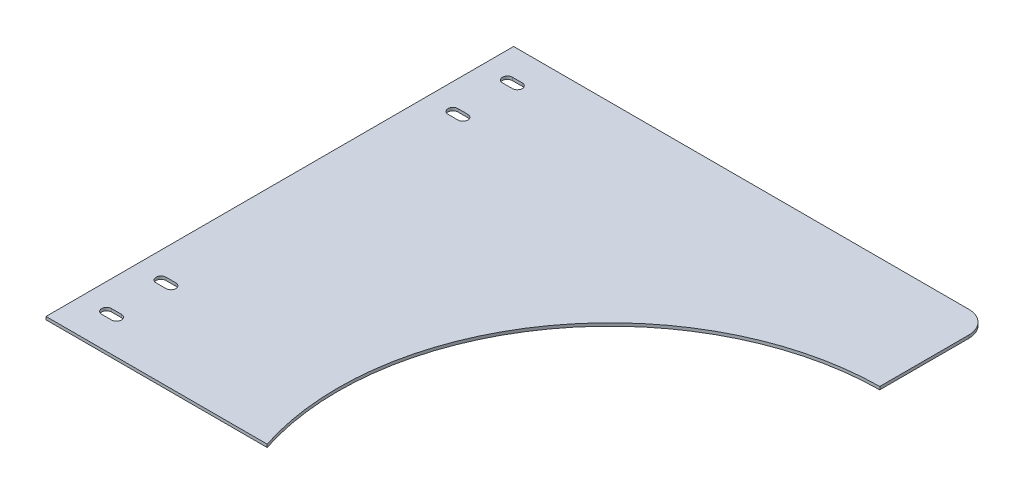
ISO-10303-21;
HEADER;
FILE_DESCRIPTION(('STEP AP214'),'2;1');
FILE_NAME('part.step','',(''),(''),'','','');
FILE_SCHEMA(('AUTOMOTIVE_DESIGN { 1 0 10303 214 1 1 1 1 }'));
ENDSEC;
DATA;
#1=APPLICATION_CONTEXT('core data for automotive mechanical design processes');
#2=APPLICATION_PROTOCOL_DEFINITION('international standard','automotive_design',2000,#1);
#3=PRODUCT_CONTEXT('',#1,'mechanical');
#4=PRODUCT('Part','Part','',(#3));
#5=PRODUCT_RELATED_PRODUCT_CATEGORY('part','',(#4));
#6=PRODUCT_DEFINITION_FORMATION('','',#4);
#7=PRODUCT_DEFINITION_CONTEXT('part definition',#1,'design');
#8=PRODUCT_DEFINITION('design','',#6,#7);
#9=PRODUCT_DEFINITION_SHAPE('','',#8);
#10=(LENGTH_UNIT() NAMED_UNIT(*) SI_UNIT(.MILLI.,.METRE.));
#11=(NAMED_UNIT(*) PLANE_ANGLE_UNIT() SI_UNIT($,.RADIAN.));
#12=(NAMED_UNIT(*) SI_UNIT($,.STERADIAN.) SOLID_ANGLE_UNIT());
#13=UNCERTAINTY_MEASURE_WITH_UNIT(LENGTH_MEASURE(1.E-05),#10,'distance_accuracy_value','');
#14=(GEOMETRIC_REPRESENTATION_CONTEXT(3) GLOBAL_UNCERTAINTY_ASSIGNED_CONTEXT((#13)) GLOBAL_UNIT_ASSIGNED_CONTEXT((#10,
#11,#12)) REPRESENTATION_CONTEXT('',''));
#15=CARTESIAN_POINT('',(0.,0.,0.));
#16=DIRECTION('',(0.,0.,1.));
#17=DIRECTION('',(1.,0.,0.));
#18=AXIS2_PLACEMENT_3D('',#15,#16,#17);
#19=CARTESIAN_POINT('',(0.,1.2,79.));
#20=DIRECTION('',(0.,0.,-1.));
#21=DIRECTION('',(-1.,0.,0.));
#22=AXIS2_PLACEMENT_3D('',#19,#20,#21);
#23=PLANE('',#22);
#24=DIRECTION('',(1.,0.,0.));
#25=VECTOR('',#24,1.);
#26=CARTESIAN_POINT('',(0.,0.,79.));
#27=LINE('',#26,#25);
#28=CARTESIAN_POINT('',(-86.,0.,79.));
#29=VERTEX_POINT('',#28);
#30=CARTESIAN_POINT('',(-82.,0.,79.));
#31=VERTEX_POINT('',#30);
#32=EDGE_CURVE('E267',#29,#31,#27,.T.);
#33=ORIENTED_EDGE('',*,*,#32,.T.);
#34=DIRECTION('',(0.,-1.,0.));
#35=VECTOR('',#34,1.);
#36=CARTESIAN_POINT('',(-82.,1.2,79.));
#37=LINE('',#36,#35);
#38=CARTESIAN_POINT('',(-82.,1.2,79.));
#39=VERTEX_POINT('',#38);
#40=EDGE_CURVE('E11',#39,#31,#37,.T.);
#41=ORIENTED_EDGE('',*,*,#40,.F.);
#42=DIRECTION('',(1.,0.,0.));
#43=VECTOR('',#42,1.);
#44=CARTESIAN_POINT('',(0.,1.2,79.));
#45=LINE('',#44,#43);
#46=CARTESIAN_POINT('',(-86.,1.2,79.));
#47=VERTEX_POINT('',#46);
#48=EDGE_CURVE('E197',#47,#39,#45,.T.);
#49=ORIENTED_EDGE('',*,*,#48,.F.);
#50=DIRECTION('',(0.,-1.,0.));
#51=VECTOR('',#50,1.);
#52=CARTESIAN_POINT('',(-86.,1.2,79.));
#53=LINE('',#52,#51);
#54=EDGE_CURVE('E275',#47,#29,#53,.T.);
#55=ORIENTED_EDGE('',*,*,#54,.T.);
#56=EDGE_LOOP('',(#33,#41,#49,#55));
#57=FACE_BOUND('',#56,.T.);
#58=ADVANCED_FACE('F36',(#57),#23,.F.);
#59=CARTESIAN_POINT('',(-82.,1.2,81.));
#60=DIRECTION('',(0.,-1.,0.));
#61=DIRECTION('',(0.,0.,-1.));
#62=AXIS2_PLACEMENT_3D('',#59,#60,#61);
#63=CYLINDRICAL_SURFACE('',#62,2.);
#64=CARTESIAN_POINT('',(-82.,0.,81.));
#65=DIRECTION('',(0.,1.,0.));
#66=DIRECTION('',(0.,0.,1.));
#67=AXIS2_PLACEMENT_3D('',#64,#65,#66);
#68=CIRCLE('',#67,2.);
#69=CARTESIAN_POINT('',(-82.,0.,83.));
#70=VERTEX_POINT('',#69);
#71=EDGE_CURVE('E203',#31,#70,#68,.F.);
#72=ORIENTED_EDGE('',*,*,#71,.T.);
#73=DIRECTION('',(0.,-1.,0.));
#74=VECTOR('',#73,1.);
#75=CARTESIAN_POINT('',(-82.,1.2,83.));
#76=LINE('',#75,#74);
#77=CARTESIAN_POINT('',(-82.,1.2,83.));
#78=VERTEX_POINT('',#77);
#79=EDGE_CURVE('E46',#78,#70,#76,.T.);
#80=ORIENTED_EDGE('',*,*,#79,.F.);
#81=CARTESIAN_POINT('',(-82.,1.2,81.));
#82=DIRECTION('',(0.,1.,0.));
#83=DIRECTION('',(0.,0.,1.));
#84=AXIS2_PLACEMENT_3D('',#81,#82,#83);
#85=CIRCLE('',#84,2.);
#86=EDGE_CURVE('E191',#39,#78,#85,.F.);
#87=ORIENTED_EDGE('',*,*,#86,.F.);
#88=ORIENTED_EDGE('',*,*,#40,.T.);
#89=EDGE_LOOP('',(#72,#80,#87,#88));
#90=FACE_BOUND('',#89,.T.);
#91=ADVANCED_FACE('F202',(#90),#63,.F.);
#92=CARTESIAN_POINT('',(0.,1.2,83.));
#93=DIRECTION('',(0.,0.,-1.));
#94=DIRECTION('',(-1.,0.,0.));
#95=AXIS2_PLACEMENT_3D('',#92,#93,#94);
#96=PLANE('',#95);
#97=DIRECTION('',(1.,0.,0.));
#98=VECTOR('',#97,1.);
#99=CARTESIAN_POINT('',(0.,0.,83.));
#100=LINE('',#99,#98);
#101=CARTESIAN_POINT('',(-86.,0.,83.));
#102=VERTEX_POINT('',#101);
#103=EDGE_CURVE('E271',#102,#70,#100,.T.);
#104=ORIENTED_EDGE('',*,*,#103,.F.);
#105=DIRECTION('',(0.,-1.,0.));
#106=VECTOR('',#105,1.);
#107=CARTESIAN_POINT('',(-86.,1.2,83.));
#108=LINE('',#107,#106);
#109=CARTESIAN_POINT('',(-86.,1.2,83.));
#110=VERTEX_POINT('',#109);
#111=EDGE_CURVE('E125',#110,#102,#108,.T.);
#112=ORIENTED_EDGE('',*,*,#111,.F.);
#113=DIRECTION('',(1.,0.,0.));
#114=VECTOR('',#113,1.);
#115=CARTESIAN_POINT('',(0.,1.2,83.));
#116=LINE('',#115,#114);
#117=EDGE_CURVE('E195',#110,#78,#116,.T.);
#118=ORIENTED_EDGE('',*,*,#117,.T.);
#119=ORIENTED_EDGE('',*,*,#79,.T.);
#120=EDGE_LOOP('',(#104,#112,#118,#119));
#121=FACE_BOUND('',#120,.T.);
#122=ADVANCED_FACE('F208',(#121),#96,.T.);
#123=CARTESIAN_POINT('',(0.,1.2,-61.));
#124=DIRECTION('',(0.,0.,-1.));
#125=DIRECTION('',(-1.,0.,0.));
#126=AXIS2_PLACEMENT_3D('',#123,#124,#125);
#127=PLANE('',#126);
#128=DIRECTION('',(1.,0.,0.));
#129=VECTOR('',#128,1.);
#130=CARTESIAN_POINT('',(0.,0.,-61.));
#131=LINE('',#130,#129);
#132=CARTESIAN_POINT('',(-86.,0.,-61.));
#133=VERTEX_POINT('',#132);
#134=CARTESIAN_POINT('',(-82.,0.,-61.));
#135=VERTEX_POINT('',#134);
#136=EDGE_CURVE('E256',#133,#135,#131,.T.);
#137=ORIENTED_EDGE('',*,*,#136,.T.);
#138=DIRECTION('',(0.,-1.,0.));
#139=VECTOR('',#138,1.);
#140=CARTESIAN_POINT('',(-82.,1.2,-61.));
#141=LINE('',#140,#139);
#142=CARTESIAN_POINT('',(-82.,1.2,-61.));
#143=VERTEX_POINT('',#142);
#144=EDGE_CURVE('E277',#143,#135,#141,.T.);
#145=ORIENTED_EDGE('',*,*,#144,.F.);
#146=DIRECTION('',(1.,0.,0.));
#147=VECTOR('',#146,1.);
#148=CARTESIAN_POINT('',(0.,1.2,-61.));
#149=LINE('',#148,#147);
#150=CARTESIAN_POINT('',(-86.,1.2,-61.));
#151=VERTEX_POINT('',#150);
#152=EDGE_CURVE('E566',#151,#143,#149,.T.);
#153=ORIENTED_EDGE('',*,*,#152,.F.);
#154=DIRECTION('',(0.,-1.,0.));
#155=VECTOR('',#154,1.);
#156=CARTESIAN_POINT('',(-86.,1.2,-61.));
#157=LINE('',#156,#155);
#158=EDGE_CURVE('E279',#151,#133,#157,.T.);
#159=ORIENTED_EDGE('',*,*,#158,.T.);
#160=EDGE_LOOP('',(#137,#145,#153,#159));
#161=FACE_BOUND('',#160,.T.);
#162=ADVANCED_FACE('F360',(#161),#127,.F.);
#163=CARTESIAN_POINT('',(-82.,1.2,-59.));
#164=DIRECTION('',(0.,-1.,0.));
#165=DIRECTION('',(0.,0.,-1.));
#166=AXIS2_PLACEMENT_3D('',#163,#164,#165);
#167=CYLINDRICAL_SURFACE('',#166,2.);
#168=CARTESIAN_POINT('',(-82.,0.,-59.));
#169=DIRECTION('',(0.,1.,0.));
#170=DIRECTION('',(0.,0.,1.));
#171=AXIS2_PLACEMENT_3D('',#168,#169,#170);
#172=CIRCLE('',#171,2.);
#173=CARTESIAN_POINT('',(-82.,0.,-57.));
#174=VERTEX_POINT('',#173);
#175=EDGE_CURVE('E259',#135,#174,#172,.F.);
#176=ORIENTED_EDGE('',*,*,#175,.T.);
#177=DIRECTION('',(0.,-1.,0.));
#178=VECTOR('',#177,1.);
#179=CARTESIAN_POINT('',(-82.,1.2,-57.));
#180=LINE('',#179,#178);
#181=CARTESIAN_POINT('',(-82.,1.2,-57.));
#182=VERTEX_POINT('',#181);
#183=EDGE_CURVE('E285',#182,#174,#180,.T.);
#184=ORIENTED_EDGE('',*,*,#183,.F.);
#185=CARTESIAN_POINT('',(-82.,1.2,-59.));
#186=DIRECTION('',(0.,1.,0.));
#187=DIRECTION('',(0.,0.,1.));
#188=AXIS2_PLACEMENT_3D('',#185,#186,#187);
#189=CIRCLE('',#188,2.);
#190=EDGE_CURVE('E569',#143,#182,#189,.F.);
#191=ORIENTED_EDGE('',*,*,#190,.F.);
#192=ORIENTED_EDGE('',*,*,#144,.T.);
#193=EDGE_LOOP('',(#176,#184,#191,#192));
#194=FACE_BOUND('',#193,.T.);
#195=ADVANCED_FACE('F356',(#194),#167,.F.);
#196=CARTESIAN_POINT('',(0.,1.2,-57.));
#197=DIRECTION('',(0.,0.,-1.));
#198=DIRECTION('',(-1.,0.,0.));
#199=AXIS2_PLACEMENT_3D('',#196,#197,#198);
#200=PLANE('',#199);
#201=DIRECTION('',(1.,0.,0.));
#202=VECTOR('',#201,1.);
#203=CARTESIAN_POINT('',(0.,0.,-57.));
#204=LINE('',#203,#202);
#205=CARTESIAN_POINT('',(-86.,0.,-57.));
#206=VERTEX_POINT('',#205);
#207=EDGE_CURVE('E262',#206,#174,#204,.T.);
#208=ORIENTED_EDGE('',*,*,#207,.F.);
#209=DIRECTION('',(0.,-1.,0.));
#210=VECTOR('',#209,1.);
#211=CARTESIAN_POINT('',(-86.,1.2,-57.));
#212=LINE('',#211,#210);
#213=CARTESIAN_POINT('',(-86.,1.2,-57.));
#214=VERTEX_POINT('',#213);
#215=EDGE_CURVE('E282',#214,#206,#212,.T.);
#216=ORIENTED_EDGE('',*,*,#215,.F.);
#217=DIRECTION('',(1.,0.,0.));
#218=VECTOR('',#217,1.);
#219=CARTESIAN_POINT('',(0.,1.2,-57.));
#220=LINE('',#219,#218);
#221=EDGE_CURVE('E578',#214,#182,#220,.T.);
#222=ORIENTED_EDGE('',*,*,#221,.T.);
#223=ORIENTED_EDGE('',*,*,#183,.T.);
#224=EDGE_LOOP('',(#208,#216,#222,#223));
#225=FACE_BOUND('',#224,.T.);
#226=ADVANCED_FACE('F352',(#225),#200,.T.);
#227=CARTESIAN_POINT('',(96.5000000000001,1.2,0.));
#228=DIRECTION('',(1.,0.,0.));
#229=DIRECTION('',(0.,0.,-1.));
#230=AXIS2_PLACEMENT_3D('',#227,#228,#229);
#231=PLANE('',#230);
#232=DIRECTION('',(0.,0.,1.));
#233=VECTOR('',#232,1.);
#234=CARTESIAN_POINT('',(96.5000000000001,0.,0.));
#235=LINE('',#234,#233);
#236=CARTESIAN_POINT('',(96.5000000000001,0.,-84.9999999999999));
#237=VERTEX_POINT('',#236);
#238=CARTESIAN_POINT('',(96.5000000000001,0.,-48.9954544515363));
#239=VERTEX_POINT('',#238);
#240=EDGE_CURVE('E238',#237,#239,#235,.T.);
#241=ORIENTED_EDGE('',*,*,#240,.F.);
#242=DIRECTION('',(0.,-1.,0.));
#243=VECTOR('',#242,1.);
#244=CARTESIAN_POINT('',(96.5000000000001,1.2,-84.9999999999999));
#245=LINE('',#244,#243);
#246=CARTESIAN_POINT('',(96.5000000000001,1.2,-84.9999999999999));
#247=VERTEX_POINT('',#246);
#248=EDGE_CURVE('E283',#247,#237,#245,.T.);
#249=ORIENTED_EDGE('',*,*,#248,.F.);
#250=DIRECTION('',(0.,0.,1.));
#251=VECTOR('',#250,1.);
#252=CARTESIAN_POINT('',(96.5000000000001,1.2,0.));
#253=LINE('',#252,#251);
#254=CARTESIAN_POINT('',(96.5000000000001,1.2,-48.9954544515363));
#255=VERTEX_POINT('',#254);
#256=EDGE_CURVE('E563',#247,#255,#253,.T.);
#257=ORIENTED_EDGE('',*,*,#256,.T.);
#258=DIRECTION('',(0.,-1.,0.));
#259=VECTOR('',#258,1.);
#260=CARTESIAN_POINT('',(96.5000000000001,1.2,-48.9954544515363));
#261=LINE('',#260,#259);
#262=EDGE_CURVE('E289',#255,#239,#261,.T.);
#263=ORIENTED_EDGE('',*,*,#262,.T.);
#264=EDGE_LOOP('',(#241,#249,#257,#263));
#265=FACE_BOUND('',#264,.T.);
#266=ADVANCED_FACE('F355',(#265),#231,.T.);
#267=CARTESIAN_POINT('',(87.5000000000001,1.2,-85.));
#268=DIRECTION('',(0.,-1.,0.));
#269=DIRECTION('',(0.,0.,-1.));
#270=AXIS2_PLACEMENT_3D('',#267,#268,#269);
#271=CYLINDRICAL_SURFACE('',#270,8.99999999999999);
#272=CARTESIAN_POINT('',(87.5000000000001,0.,-85.));
#273=DIRECTION('',(0.,1.,0.));
#274=DIRECTION('',(0.,0.,1.));
#275=AXIS2_PLACEMENT_3D('',#272,#273,#274);
#276=CIRCLE('',#275,8.99999999999999);
#277=CARTESIAN_POINT('',(87.5,0.,-94.));
#278=VERTEX_POINT('',#277);
#279=EDGE_CURVE('E241',#237,#278,#276,.T.);
#280=ORIENTED_EDGE('',*,*,#279,.T.);
#281=DIRECTION('',(0.,-1.,0.));
#282=VECTOR('',#281,1.);
#283=CARTESIAN_POINT('',(87.5,1.2,-94.));
#284=LINE('',#283,#282);
#285=CARTESIAN_POINT('',(87.5,1.2,-94.));
#286=VERTEX_POINT('',#285);
#287=EDGE_CURVE('E299',#286,#278,#284,.T.);
#288=ORIENTED_EDGE('',*,*,#287,.F.);
#289=CARTESIAN_POINT('',(87.5000000000001,1.2,-85.));
#290=DIRECTION('',(0.,1.,0.));
#291=DIRECTION('',(0.,0.,1.));
#292=AXIS2_PLACEMENT_3D('',#289,#290,#291);
#293=CIRCLE('',#292,8.99999999999999);
#294=EDGE_CURVE('E593',#247,#286,#293,.T.);
#295=ORIENTED_EDGE('',*,*,#294,.F.);
#296=ORIENTED_EDGE('',*,*,#248,.T.);
#297=EDGE_LOOP('',(#280,#288,#295,#296));
#298=FACE_BOUND('',#297,.T.);
#299=ADVANCED_FACE('F381',(#298),#271,.T.);
#300=CARTESIAN_POINT('',(0.,1.2,-94.));
#301=DIRECTION('',(0.,0.,-1.));
#302=DIRECTION('',(-1.,0.,0.));
#303=AXIS2_PLACEMENT_3D('',#300,#301,#302);
#304=PLANE('',#303);
#305=DIRECTION('',(1.,0.,0.));
#306=VECTOR('',#305,1.);
#307=CARTESIAN_POINT('',(0.,0.,-94.));
#308=LINE('',#307,#306);
#309=CARTESIAN_POINT('',(-96.4999999999999,0.,-94.));
#310=VERTEX_POINT('',#309);
#311=EDGE_CURVE('E244',#310,#278,#308,.T.);
#312=ORIENTED_EDGE('',*,*,#311,.F.);
#313=DIRECTION('',(0.,-1.,0.));
#314=VECTOR('',#313,1.);
#315=CARTESIAN_POINT('',(-96.4999999999999,1.2,-94.));
#316=LINE('',#315,#314);
#317=CARTESIAN_POINT('',(-96.4999999999999,1.2,-94.));
#318=VERTEX_POINT('',#317);
#319=EDGE_CURVE('E297',#318,#310,#316,.T.);
#320=ORIENTED_EDGE('',*,*,#319,.F.);
#321=DIRECTION('',(1.,0.,0.));
#322=VECTOR('',#321,1.);
#323=CARTESIAN_POINT('',(0.,1.2,-94.));
#324=LINE('',#323,#322);
#325=EDGE_CURVE('E590',#318,#286,#324,.T.);
#326=ORIENTED_EDGE('',*,*,#325,.T.);
#327=ORIENTED_EDGE('',*,*,#287,.T.);
#328=EDGE_LOOP('',(#312,#320,#326,#327));
#329=FACE_BOUND('',#328,.T.);
#330=ADVANCED_FACE('F377',(#329),#304,.T.);
#331=CARTESIAN_POINT('',(-96.4999999999999,1.2,0.));
#332=DIRECTION('',(1.,0.,0.));
#333=DIRECTION('',(0.,0.,-1.));
#334=AXIS2_PLACEMENT_3D('',#331,#332,#333);
#335=PLANE('',#334);
#336=DIRECTION('',(0.,0.,1.));
#337=VECTOR('',#336,1.);
#338=CARTESIAN_POINT('',(-96.4999999999999,0.,0.));
#339=LINE('',#338,#337);
#340=CARTESIAN_POINT('',(-96.4999999999999,0.,95.));
#341=VERTEX_POINT('',#340);
#342=EDGE_CURVE('E247',#310,#341,#339,.T.);
#343=ORIENTED_EDGE('',*,*,#342,.T.);
#344=DIRECTION('',(0.,-1.,0.));
#345=VECTOR('',#344,1.);
#346=CARTESIAN_POINT('',(-96.4999999999999,1.2,95.));
#347=LINE('',#346,#345);
#348=CARTESIAN_POINT('',(-96.4999999999999,1.2,95.));
#349=VERTEX_POINT('',#348);
#350=EDGE_CURVE('E294',#349,#341,#347,.T.);
#351=ORIENTED_EDGE('',*,*,#350,.F.);
#352=DIRECTION('',(0.,0.,1.));
#353=VECTOR('',#352,1.);
#354=CARTESIAN_POINT('',(-96.4999999999999,1.2,0.));
#355=LINE('',#354,#353);
#356=EDGE_CURVE('E587',#318,#349,#355,.T.);
#357=ORIENTED_EDGE('',*,*,#356,.F.);
#358=ORIENTED_EDGE('',*,*,#319,.T.);
#359=EDGE_LOOP('',(#343,#351,#357,#358));
#360=FACE_BOUND('',#359,.T.);
#361=ADVANCED_FACE('F373',(#360),#335,.F.);
#362=CARTESIAN_POINT('',(0.,1.2,95.));
#363=DIRECTION('',(0.,0.,-1.));
#364=DIRECTION('',(-1.,0.,0.));
#365=AXIS2_PLACEMENT_3D('',#362,#363,#364);
#366=PLANE('',#365);
#367=DIRECTION('',(1.,0.,0.));
#368=VECTOR('',#367,1.);
#369=CARTESIAN_POINT('',(0.,0.,95.));
#370=LINE('',#369,#368);
#371=CARTESIAN_POINT('',(-7.1135746449761,0.,95.));
#372=VERTEX_POINT('',#371);
#373=EDGE_CURVE('E250',#341,#372,#370,.T.);
#374=ORIENTED_EDGE('',*,*,#373,.T.);
#375=DIRECTION('',(0.,-1.,0.));
#376=VECTOR('',#375,1.);
#377=CARTESIAN_POINT('',(-7.1135746449761,1.2,95.));
#378=LINE('',#377,#376);
#379=CARTESIAN_POINT('',(-7.1135746449761,1.2,95.));
#380=VERTEX_POINT('',#379);
#381=EDGE_CURVE('E291',#380,#372,#378,.T.);
#382=ORIENTED_EDGE('',*,*,#381,.F.);
#383=DIRECTION('',(1.,0.,0.));
#384=VECTOR('',#383,1.);
#385=CARTESIAN_POINT('',(0.,1.2,95.));
#386=LINE('',#385,#384);
#387=EDGE_CURVE('E585',#349,#380,#386,.T.);
#388=ORIENTED_EDGE('',*,*,#387,.F.);
#389=ORIENTED_EDGE('',*,*,#350,.T.);
#390=EDGE_LOOP('',(#374,#382,#388,#389));
#391=FACE_BOUND('',#390,.T.);
#392=ADVANCED_FACE('F369',(#391),#366,.F.);
#393=CARTESIAN_POINT('',(-86.,1.2,-81.));
#394=DIRECTION('',(0.,-1.,0.));
#395=DIRECTION('',(0.,0.,-1.));
#396=AXIS2_PLACEMENT_3D('',#393,#394,#395);
#397=CYLINDRICAL_SURFACE('',#396,2.);
#398=CARTESIAN_POINT('',(-86.,0.,-81.));
#399=DIRECTION('',(0.,1.,0.));
#400=DIRECTION('',(0.,0.,1.));
#401=AXIS2_PLACEMENT_3D('',#398,#399,#400);
#402=CIRCLE('',#401,2.);
#403=CARTESIAN_POINT('',(-86.,0.,-83.));
#404=VERTEX_POINT('',#403);
#405=CARTESIAN_POINT('',(-86.,0.,-79.));
#406=VERTEX_POINT('',#405);
#407=EDGE_CURVE('E226',#404,#406,#402,.T.);
#408=ORIENTED_EDGE('',*,*,#407,.F.);
#409=DIRECTION('',(0.,-1.,0.));
#410=VECTOR('',#409,1.);
#411=CARTESIAN_POINT('',(-86.,1.2,-83.));
#412=LINE('',#411,#410);
#413=CARTESIAN_POINT('',(-86.,1.2,-83.));
#414=VERTEX_POINT('',#413);
#415=EDGE_CURVE('E292',#414,#404,#412,.T.);
#416=ORIENTED_EDGE('',*,*,#415,.F.);
#417=CARTESIAN_POINT('',(-86.,1.2,-81.));
#418=DIRECTION('',(0.,1.,0.));
#419=DIRECTION('',(0.,0.,1.));
#420=AXIS2_PLACEMENT_3D('',#417,#418,#419);
#421=CIRCLE('',#420,2.);
#422=CARTESIAN_POINT('',(-86.,1.2,-79.));
#423=VERTEX_POINT('',#422);
#424=EDGE_CURVE('E558',#414,#423,#421,.T.);
#425=ORIENTED_EDGE('',*,*,#424,.T.);
#426=DIRECTION('',(0.,-1.,0.));
#427=VECTOR('',#426,1.);
#428=CARTESIAN_POINT('',(-86.,1.2,-79.));
#429=LINE('',#428,#427);
#430=EDGE_CURVE('E302',#423,#406,#429,.T.);
#431=ORIENTED_EDGE('',*,*,#430,.T.);
#432=EDGE_LOOP('',(#408,#416,#425,#431));
#433=FACE_BOUND('',#432,.T.);
#434=ADVANCED_FACE('F372',(#433),#397,.F.);
#435=CARTESIAN_POINT('',(0.,1.2,-83.));
#436=DIRECTION('',(0.,0.,-1.));
#437=DIRECTION('',(-1.,0.,0.));
#438=AXIS2_PLACEMENT_3D('',#435,#436,#437);
#439=PLANE('',#438);
#440=DIRECTION('',(1.,0.,0.));
#441=VECTOR('',#440,1.);
#442=CARTESIAN_POINT('',(0.,0.,-83.));
#443=LINE('',#442,#441);
#444=CARTESIAN_POINT('',(-82.,0.,-83.));
#445=VERTEX_POINT('',#444);
#446=EDGE_CURVE('E229',#404,#445,#443,.T.);
#447=ORIENTED_EDGE('',*,*,#446,.T.);
#448=DIRECTION('',(0.,-1.,0.));
#449=VECTOR('',#448,1.);
#450=CARTESIAN_POINT('',(-82.,1.2,-83.));
#451=LINE('',#450,#449);
#452=CARTESIAN_POINT('',(-82.,1.2,-83.));
#453=VERTEX_POINT('',#452);
#454=EDGE_CURVE('E306',#453,#445,#451,.T.);
#455=ORIENTED_EDGE('',*,*,#454,.F.);
#456=DIRECTION('',(1.,0.,0.));
#457=VECTOR('',#456,1.);
#458=CARTESIAN_POINT('',(0.,1.2,-83.));
#459=LINE('',#458,#457);
#460=EDGE_CURVE('E602',#414,#453,#459,.T.);
#461=ORIENTED_EDGE('',*,*,#460,.F.);
#462=ORIENTED_EDGE('',*,*,#415,.T.);
#463=EDGE_LOOP('',(#447,#455,#461,#462));
#464=FACE_BOUND('',#463,.T.);
#465=ADVANCED_FACE('F395',(#464),#439,.F.);
#466=CARTESIAN_POINT('',(-82.,1.2,-81.));
#467=DIRECTION('',(0.,-1.,0.));
#468=DIRECTION('',(0.,0.,-1.));
#469=AXIS2_PLACEMENT_3D('',#466,#467,#468);
#470=CYLINDRICAL_SURFACE('',#469,2.);
#471=CARTESIAN_POINT('',(-82.,0.,-81.));
#472=DIRECTION('',(0.,1.,0.));
#473=DIRECTION('',(0.,0.,1.));
#474=AXIS2_PLACEMENT_3D('',#471,#472,#473);
#475=CIRCLE('',#474,2.);
#476=CARTESIAN_POINT('',(-82.,0.,-79.));
#477=VERTEX_POINT('',#476);
#478=EDGE_CURVE('E232',#477,#445,#475,.T.);
#479=ORIENTED_EDGE('',*,*,#478,.F.);
#480=DIRECTION('',(0.,-1.,0.));
#481=VECTOR('',#480,1.);
#482=CARTESIAN_POINT('',(-82.,1.2,-79.));
#483=LINE('',#482,#481);
#484=CARTESIAN_POINT('',(-82.,1.2,-79.));
#485=VERTEX_POINT('',#484);
#486=EDGE_CURVE('E304',#485,#477,#483,.T.);
#487=ORIENTED_EDGE('',*,*,#486,.F.);
#488=CARTESIAN_POINT('',(-82.,1.2,-81.));
#489=DIRECTION('',(0.,1.,0.));
#490=DIRECTION('',(0.,0.,1.));
#491=AXIS2_PLACEMENT_3D('',#488,#489,#490);
#492=CIRCLE('',#491,2.);
#493=EDGE_CURVE('E599',#485,#453,#492,.T.);
#494=ORIENTED_EDGE('',*,*,#493,.T.);
#495=ORIENTED_EDGE('',*,*,#454,.T.);
#496=EDGE_LOOP('',(#479,#487,#494,#495));
#497=FACE_BOUND('',#496,.T.);
#498=ADVANCED_FACE('F392',(#497),#470,.F.);
#499=CARTESIAN_POINT('',(-86.,1.2,59.));
#500=DIRECTION('',(0.,-1.,0.));
#501=DIRECTION('',(0.,0.,-1.));
#502=AXIS2_PLACEMENT_3D('',#499,#500,#501);
#503=CYLINDRICAL_SURFACE('',#502,2.);
#504=CARTESIAN_POINT('',(-86.,0.,59.));
#505=DIRECTION('',(0.,1.,0.));
#506=DIRECTION('',(0.,0.,1.));
#507=AXIS2_PLACEMENT_3D('',#504,#505,#506);
#508=CIRCLE('',#507,2.);
#509=CARTESIAN_POINT('',(-86.,0.,57.));
#510=VERTEX_POINT('',#509);
#511=CARTESIAN_POINT('',(-86.,0.,61.));
#512=VERTEX_POINT('',#511);
#513=EDGE_CURVE('E214',#510,#512,#508,.T.);
#514=ORIENTED_EDGE('',*,*,#513,.F.);
#515=DIRECTION('',(0.,-1.,0.));
#516=VECTOR('',#515,1.);
#517=CARTESIAN_POINT('',(-86.,1.2,57.));
#518=LINE('',#517,#516);
#519=CARTESIAN_POINT('',(-86.,1.2,57.));
#520=VERTEX_POINT('',#519);
#521=EDGE_CURVE('E40',#520,#510,#518,.T.);
#522=ORIENTED_EDGE('',*,*,#521,.F.);
#523=CARTESIAN_POINT('',(-86.,1.2,59.));
#524=DIRECTION('',(0.,1.,0.));
#525=DIRECTION('',(0.,0.,1.));
#526=AXIS2_PLACEMENT_3D('',#523,#524,#525);
#527=CIRCLE('',#526,2.);
#528=CARTESIAN_POINT('',(-86.,1.2,61.));
#529=VERTEX_POINT('',#528);
#530=EDGE_CURVE('E274',#520,#529,#527,.T.);
#531=ORIENTED_EDGE('',*,*,#530,.T.);
#532=DIRECTION('',(0.,-1.,0.));
#533=VECTOR('',#532,1.);
#534=CARTESIAN_POINT('',(-86.,1.2,61.));
#535=LINE('',#534,#533);
#536=EDGE_CURVE('E210',#529,#512,#535,.T.);
#537=ORIENTED_EDGE('',*,*,#536,.T.);
#538=EDGE_LOOP('',(#514,#522,#531,#537));
#539=FACE_BOUND('',#538,.T.);
#540=ADVANCED_FACE('F38',(#539),#503,.F.);
#541=CARTESIAN_POINT('',(0.,1.2,57.));
#542=DIRECTION('',(0.,0.,-1.));
#543=DIRECTION('',(-1.,0.,0.));
#544=AXIS2_PLACEMENT_3D('',#541,#542,#543);
#545=PLANE('',#544);
#546=DIRECTION('',(1.,0.,0.));
#547=VECTOR('',#546,1.);
#548=CARTESIAN_POINT('',(0.,0.,57.));
#549=LINE('',#548,#547);
#550=CARTESIAN_POINT('',(-82.,0.,57.));
#551=VERTEX_POINT('',#550);
#552=EDGE_CURVE('E217',#510,#551,#549,.T.);
#553=ORIENTED_EDGE('',*,*,#552,.T.);
#554=DIRECTION('',(0.,-1.,0.));
#555=VECTOR('',#554,1.);
#556=CARTESIAN_POINT('',(-82.,1.2,57.));
#557=LINE('',#556,#555);
#558=CARTESIAN_POINT('',(-82.,1.2,57.));
#559=VERTEX_POINT('',#558);
#560=EDGE_CURVE('E311',#559,#551,#557,.T.);
#561=ORIENTED_EDGE('',*,*,#560,.F.);
#562=DIRECTION('',(1.,0.,0.));
#563=VECTOR('',#562,1.);
#564=CARTESIAN_POINT('',(0.,1.2,57.));
#565=LINE('',#564,#563);
#566=EDGE_CURVE('E319',#520,#559,#565,.T.);
#567=ORIENTED_EDGE('',*,*,#566,.F.);
#568=ORIENTED_EDGE('',*,*,#521,.T.);
#569=EDGE_LOOP('',(#553,#561,#567,#568));
#570=FACE_BOUND('',#569,.T.);
#571=ADVANCED_FACE('F318',(#570),#545,.F.);
#572=CARTESIAN_POINT('',(-82.,1.2,59.));
#573=DIRECTION('',(0.,-1.,0.));
#574=DIRECTION('',(0.,0.,-1.));
#575=AXIS2_PLACEMENT_3D('',#572,#573,#574);
#576=CYLINDRICAL_SURFACE('',#575,2.);
#577=CARTESIAN_POINT('',(-82.,0.,59.));
#578=DIRECTION('',(0.,1.,0.));
#579=DIRECTION('',(0.,0.,1.));
#580=AXIS2_PLACEMENT_3D('',#577,#578,#579);
#581=CIRCLE('',#580,2.);
#582=CARTESIAN_POINT('',(-82.,0.,61.));
#583=VERTEX_POINT('',#582);
#584=EDGE_CURVE('E220',#583,#551,#581,.T.);
#585=ORIENTED_EDGE('',*,*,#584,.F.);
#586=DIRECTION('',(0.,-1.,0.));
#587=VECTOR('',#586,1.);
#588=CARTESIAN_POINT('',(-82.,1.2,61.));
#589=LINE('',#588,#587);
#590=CARTESIAN_POINT('',(-82.,1.2,61.));
#591=VERTEX_POINT('',#590);
#592=EDGE_CURVE('E310',#591,#583,#589,.T.);
#593=ORIENTED_EDGE('',*,*,#592,.F.);
#594=CARTESIAN_POINT('',(-82.,1.2,59.));
#595=DIRECTION('',(0.,1.,0.));
#596=DIRECTION('',(0.,0.,1.));
#597=AXIS2_PLACEMENT_3D('',#594,#595,#596);
#598=CIRCLE('',#597,2.);
#599=EDGE_CURVE('E606',#591,#559,#598,.T.);
#600=ORIENTED_EDGE('',*,*,#599,.T.);
#601=ORIENTED_EDGE('',*,*,#560,.T.);
#602=EDGE_LOOP('',(#585,#593,#600,#601));
#603=FACE_BOUND('',#602,.T.);
#604=ADVANCED_FACE('F331',(#603),#576,.F.);
#605=CARTESIAN_POINT('',(-86.,1.2,-59.));
#606=DIRECTION('',(0.,-1.,0.));
#607=DIRECTION('',(0.,0.,-1.));
#608=AXIS2_PLACEMENT_3D('',#605,#606,#607);
#609=CYLINDRICAL_SURFACE('',#608,2.);
#610=CARTESIAN_POINT('',(-86.,0.,-59.));
#611=DIRECTION('',(0.,1.,0.));
#612=DIRECTION('',(0.,0.,1.));
#613=AXIS2_PLACEMENT_3D('',#610,#611,#612);
#614=CIRCLE('',#613,2.);
#615=EDGE_CURVE('E265',#206,#133,#614,.F.);
#616=ORIENTED_EDGE('',*,*,#615,.T.);
#617=ORIENTED_EDGE('',*,*,#158,.F.);
#618=CARTESIAN_POINT('',(-86.,1.2,-59.));
#619=DIRECTION('',(0.,1.,0.));
#620=DIRECTION('',(0.,0.,1.));
#621=AXIS2_PLACEMENT_3D('',#618,#619,#620);
#622=CIRCLE('',#621,2.);
#623=EDGE_CURVE('E572',#214,#151,#622,.F.);
#624=ORIENTED_EDGE('',*,*,#623,.F.);
#625=ORIENTED_EDGE('',*,*,#215,.T.);
#626=EDGE_LOOP('',(#616,#617,#624,#625));
#627=FACE_BOUND('',#626,.T.);
#628=ADVANCED_FACE('F333',(#627),#609,.F.);
#629=CARTESIAN_POINT('',(97.5000000000001,1.2,61.));
#630=DIRECTION('',(0.,-1.,0.));
#631=DIRECTION('',(0.,0.,-1.));
#632=AXIS2_PLACEMENT_3D('',#629,#630,#631);
#633=CYLINDRICAL_SURFACE('',#632,110.);
#634=CARTESIAN_POINT('',(97.5000000000001,0.,61.));
#635=DIRECTION('',(0.,1.,0.));
#636=DIRECTION('',(0.,0.,1.));
#637=AXIS2_PLACEMENT_3D('',#634,#635,#636);
#638=CIRCLE('',#637,110.);
#639=EDGE_CURVE('E253',#239,#372,#638,.T.);
#640=ORIENTED_EDGE('',*,*,#639,.F.);
#641=ORIENTED_EDGE('',*,*,#262,.F.);
#642=CARTESIAN_POINT('',(97.5000000000001,1.2,61.));
#643=DIRECTION('',(0.,1.,0.));
#644=DIRECTION('',(0.,0.,1.));
#645=AXIS2_PLACEMENT_3D('',#642,#643,#644);
#646=CIRCLE('',#645,110.);
#647=EDGE_CURVE('E574',#255,#380,#646,.T.);
#648=ORIENTED_EDGE('',*,*,#647,.T.);
#649=ORIENTED_EDGE('',*,*,#381,.T.);
#650=EDGE_LOOP('',(#640,#641,#648,#649));
#651=FACE_BOUND('',#650,.T.);
#652=ADVANCED_FACE('F339',(#651),#633,.F.);
#653=CARTESIAN_POINT('',(0.,1.2,-79.));
#654=DIRECTION('',(0.,0.,-1.));
#655=DIRECTION('',(-1.,0.,0.));
#656=AXIS2_PLACEMENT_3D('',#653,#654,#655);
#657=PLANE('',#656);
#658=DIRECTION('',(1.,0.,0.));
#659=VECTOR('',#658,1.);
#660=CARTESIAN_POINT('',(0.,0.,-79.));
#661=LINE('',#660,#659);
#662=EDGE_CURVE('E235',#406,#477,#661,.T.);
#663=ORIENTED_EDGE('',*,*,#662,.F.);
#664=ORIENTED_EDGE('',*,*,#430,.F.);
#665=DIRECTION('',(1.,0.,0.));
#666=VECTOR('',#665,1.);
#667=CARTESIAN_POINT('',(0.,1.2,-79.));
#668=LINE('',#667,#666);
#669=EDGE_CURVE('E596',#423,#485,#668,.T.);
#670=ORIENTED_EDGE('',*,*,#669,.T.);
#671=ORIENTED_EDGE('',*,*,#486,.T.);
#672=EDGE_LOOP('',(#663,#664,#670,#671));
#673=FACE_BOUND('',#672,.T.);
#674=ADVANCED_FACE('F367',(#673),#657,.T.);
#675=CARTESIAN_POINT('',(0.,1.2,61.));
#676=DIRECTION('',(0.,0.,-1.));
#677=DIRECTION('',(-1.,0.,0.));
#678=AXIS2_PLACEMENT_3D('',#675,#676,#677);
#679=PLANE('',#678);
#680=DIRECTION('',(1.,0.,0.));
#681=VECTOR('',#680,1.);
#682=CARTESIAN_POINT('',(0.,0.,61.));
#683=LINE('',#682,#681);
#684=EDGE_CURVE('E223',#512,#583,#683,.T.);
#685=ORIENTED_EDGE('',*,*,#684,.F.);
#686=ORIENTED_EDGE('',*,*,#536,.F.);
#687=DIRECTION('',(1.,0.,0.));
#688=VECTOR('',#687,1.);
#689=CARTESIAN_POINT('',(0.,1.2,61.));
#690=LINE('',#689,#688);
#691=EDGE_CURVE('E329',#529,#591,#690,.T.);
#692=ORIENTED_EDGE('',*,*,#691,.T.);
#693=ORIENTED_EDGE('',*,*,#592,.T.);
#694=EDGE_LOOP('',(#685,#686,#692,#693));
#695=FACE_BOUND('',#694,.T.);
#696=ADVANCED_FACE('F328',(#695),#679,.T.);
#697=CARTESIAN_POINT('',(-86.,1.2,81.));
#698=DIRECTION('',(0.,-1.,0.));
#699=DIRECTION('',(0.,0.,-1.));
#700=AXIS2_PLACEMENT_3D('',#697,#698,#699);
#701=CYLINDRICAL_SURFACE('',#700,2.);
#702=CARTESIAN_POINT('',(-86.,0.,81.));
#703=DIRECTION('',(0.,1.,0.));
#704=DIRECTION('',(0.,0.,1.));
#705=AXIS2_PLACEMENT_3D('',#702,#703,#704);
#706=CIRCLE('',#705,2.);
#707=EDGE_CURVE('E128',#102,#29,#706,.F.);
#708=ORIENTED_EDGE('',*,*,#707,.T.);
#709=ORIENTED_EDGE('',*,*,#54,.F.);
#710=CARTESIAN_POINT('',(-86.,1.2,81.));
#711=DIRECTION('',(0.,1.,0.));
#712=DIRECTION('',(0.,0.,1.));
#713=AXIS2_PLACEMENT_3D('',#710,#711,#712);
#714=CIRCLE('',#713,2.);
#715=EDGE_CURVE('E55',#110,#47,#714,.F.);
#716=ORIENTED_EDGE('',*,*,#715,.F.);
#717=ORIENTED_EDGE('',*,*,#111,.T.);
#718=EDGE_LOOP('',(#708,#709,#716,#717));
#719=FACE_BOUND('',#718,.T.);
#720=ADVANCED_FACE('F403',(#719),#701,.F.);
#721=CARTESIAN_POINT('',(0.,1.2,0.));
#722=DIRECTION('',(0.,1.,0.));
#723=DIRECTION('',(0.,0.,1.));
#724=AXIS2_PLACEMENT_3D('',#721,#722,#723);
#725=PLANE('',#724);
#726=ORIENTED_EDGE('',*,*,#530,.F.);
#727=ORIENTED_EDGE('',*,*,#566,.T.);
#728=ORIENTED_EDGE('',*,*,#599,.F.);
#729=ORIENTED_EDGE('',*,*,#691,.F.);
#730=EDGE_LOOP('',(#726,#727,#728,#729));
#731=FACE_BOUND('',#730,.T.);
#732=ORIENTED_EDGE('',*,*,#424,.F.);
#733=ORIENTED_EDGE('',*,*,#460,.T.);
#734=ORIENTED_EDGE('',*,*,#493,.F.);
#735=ORIENTED_EDGE('',*,*,#669,.F.);
#736=EDGE_LOOP('',(#732,#733,#734,#735));
#737=FACE_BOUND('',#736,.T.);
#738=ORIENTED_EDGE('',*,*,#256,.F.);
#739=ORIENTED_EDGE('',*,*,#294,.T.);
#740=ORIENTED_EDGE('',*,*,#325,.F.);
#741=ORIENTED_EDGE('',*,*,#356,.T.);
#742=ORIENTED_EDGE('',*,*,#387,.T.);
#743=ORIENTED_EDGE('',*,*,#647,.F.);
#744=EDGE_LOOP('',(#738,#739,#740,#741,#742,#743));
#745=FACE_BOUND('',#744,.T.);
#746=ORIENTED_EDGE('',*,*,#152,.T.);
#747=ORIENTED_EDGE('',*,*,#190,.T.);
#748=ORIENTED_EDGE('',*,*,#221,.F.);
#749=ORIENTED_EDGE('',*,*,#623,.T.);
#750=EDGE_LOOP('',(#746,#747,#748,#749));
#751=FACE_BOUND('',#750,.T.);
#752=ORIENTED_EDGE('',*,*,#48,.T.);
#753=ORIENTED_EDGE('',*,*,#86,.T.);
#754=ORIENTED_EDGE('',*,*,#117,.F.);
#755=ORIENTED_EDGE('',*,*,#715,.T.);
#756=EDGE_LOOP('',(#752,#753,#754,#755));
#757=FACE_BOUND('',#756,.T.);
#758=ADVANCED_FACE('F193',(#731,#737,#745,#751,#757),#725,.T.);
#759=CARTESIAN_POINT('',(0.,0.,0.));
#760=DIRECTION('',(0.,1.,0.));
#761=DIRECTION('',(0.,0.,1.));
#762=AXIS2_PLACEMENT_3D('',#759,#760,#761);
#763=PLANE('',#762);
#764=ORIENTED_EDGE('',*,*,#513,.T.);
#765=ORIENTED_EDGE('',*,*,#684,.T.);
#766=ORIENTED_EDGE('',*,*,#584,.T.);
#767=ORIENTED_EDGE('',*,*,#552,.F.);
#768=EDGE_LOOP('',(#764,#765,#766,#767));
#769=FACE_BOUND('',#768,.T.);
#770=ORIENTED_EDGE('',*,*,#407,.T.);
#771=ORIENTED_EDGE('',*,*,#662,.T.);
#772=ORIENTED_EDGE('',*,*,#478,.T.);
#773=ORIENTED_EDGE('',*,*,#446,.F.);
#774=EDGE_LOOP('',(#770,#771,#772,#773));
#775=FACE_BOUND('',#774,.T.);
#776=ORIENTED_EDGE('',*,*,#240,.T.);
#777=ORIENTED_EDGE('',*,*,#639,.T.);
#778=ORIENTED_EDGE('',*,*,#373,.F.);
#779=ORIENTED_EDGE('',*,*,#342,.F.);
#780=ORIENTED_EDGE('',*,*,#311,.T.);
#781=ORIENTED_EDGE('',*,*,#279,.F.);
#782=EDGE_LOOP('',(#776,#777,#778,#779,#780,#781));
#783=FACE_BOUND('',#782,.T.);
#784=ORIENTED_EDGE('',*,*,#136,.F.);
#785=ORIENTED_EDGE('',*,*,#615,.F.);
#786=ORIENTED_EDGE('',*,*,#207,.T.);
#787=ORIENTED_EDGE('',*,*,#175,.F.);
#788=EDGE_LOOP('',(#784,#785,#786,#787));
#789=FACE_BOUND('',#788,.T.);
#790=ORIENTED_EDGE('',*,*,#32,.F.);
#791=ORIENTED_EDGE('',*,*,#707,.F.);
#792=ORIENTED_EDGE('',*,*,#103,.T.);
#793=ORIENTED_EDGE('',*,*,#71,.F.);
#794=EDGE_LOOP('',(#790,#791,#792,#793));
#795=FACE_BOUND('',#794,.T.);
#796=ADVANCED_FACE('F322',(#769,#775,#783,#789,#795),#763,.F.);
#797=CLOSED_SHELL('',(#58,#91,#122,#162,#195,#226,#266,#299,#330,#361,#392,#434,#465,#498,#540,
#571,#604,#628,#652,#674,#696,#720,#758,#796));
#798=MANIFOLD_SOLID_BREP('B2',#797);
#799=ADVANCED_BREP_SHAPE_REPRESENTATION('',(#18,#798),#14);
#800=SHAPE_DEFINITION_REPRESENTATION(#9,#799);
ENDSEC;
END-ISO-10303-21;
